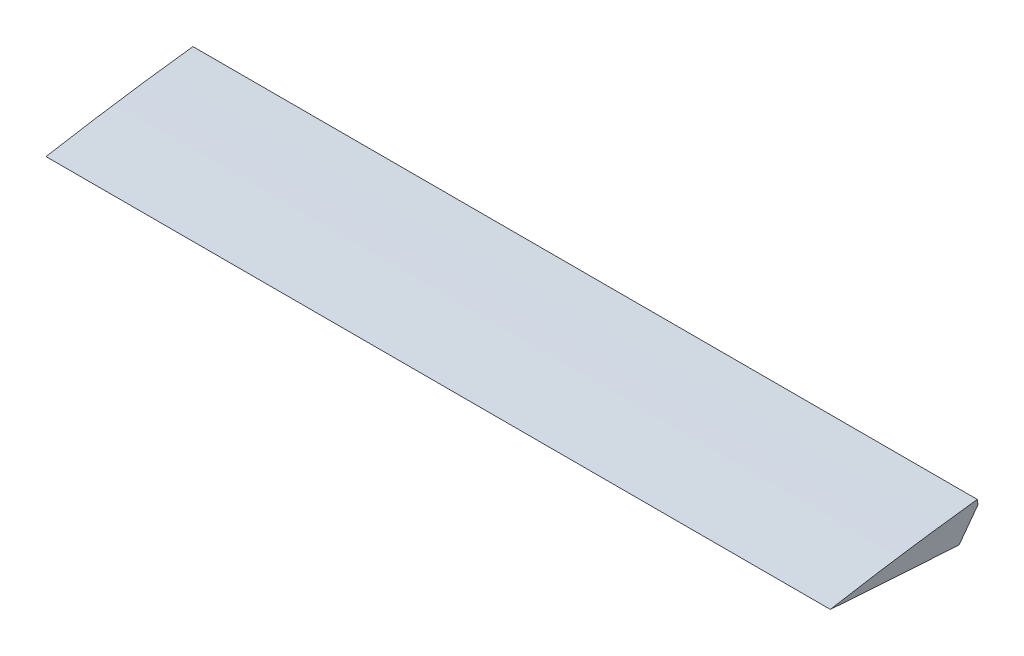
ISO-10303-21;
HEADER;
FILE_DESCRIPTION(('STEP AP214'),'2;1');
FILE_NAME('part.step','',(''),(''),'','','');
FILE_SCHEMA(('AUTOMOTIVE_DESIGN { 1 0 10303 214 1 1 1 1 }'));
ENDSEC;
DATA;
#1=APPLICATION_CONTEXT('core data for automotive mechanical design processes');
#2=APPLICATION_PROTOCOL_DEFINITION('international standard','automotive_design',2000,#1);
#3=PRODUCT_CONTEXT('',#1,'mechanical');
#4=PRODUCT('Part','Part','',(#3));
#5=PRODUCT_RELATED_PRODUCT_CATEGORY('part','',(#4));
#6=PRODUCT_DEFINITION_FORMATION('','',#4);
#7=PRODUCT_DEFINITION_CONTEXT('part definition',#1,'design');
#8=PRODUCT_DEFINITION('design','',#6,#7);
#9=PRODUCT_DEFINITION_SHAPE('','',#8);
#10=(LENGTH_UNIT() NAMED_UNIT(*) SI_UNIT(.MILLI.,.METRE.));
#11=(NAMED_UNIT(*) PLANE_ANGLE_UNIT() SI_UNIT($,.RADIAN.));
#12=(NAMED_UNIT(*) SI_UNIT($,.STERADIAN.) SOLID_ANGLE_UNIT());
#13=UNCERTAINTY_MEASURE_WITH_UNIT(LENGTH_MEASURE(1.E-05),#10,'distance_accuracy_value','');
#14=(GEOMETRIC_REPRESENTATION_CONTEXT(3) GLOBAL_UNCERTAINTY_ASSIGNED_CONTEXT((#13)) GLOBAL_UNIT_ASSIGNED_CONTEXT((#10,
#11,#12)) REPRESENTATION_CONTEXT('',''));
#15=CARTESIAN_POINT('',(0.,0.,0.));
#16=DIRECTION('',(0.,0.,1.));
#17=DIRECTION('',(1.,0.,0.));
#18=AXIS2_PLACEMENT_3D('',#15,#16,#17);
#19=CARTESIAN_POINT('',(-187.325,3467.35220178004,-189.415651011113));
#20=DIRECTION('',(1.,0.,0.));
#21=DIRECTION('',(0.,0.,1.));
#22=AXIS2_PLACEMENT_3D('',#19,#20,#21);
#23=CYLINDRICAL_SURFACE('',#22,3487.44198261828);
#24=CARTESIAN_POINT('',(187.325,3467.35220178004,-189.415651011113));
#25=DIRECTION('',(1.,0.,0.));
#26=DIRECTION('',(0.,0.,-1.));
#27=AXIS2_PLACEMENT_3D('',#24,#25,#26);
#28=CIRCLE('',#27,3487.44198261828);
#29=CARTESIAN_POINT('',(187.325,-10.4138152048303,70.1900369729345));
#30=VERTEX_POINT('',#29);
#31=CARTESIAN_POINT('',(187.325,-14.4619784667253,8.62877925903338));
#32=VERTEX_POINT('',#31);
#33=EDGE_CURVE('E78',#30,#32,#28,.T.);
#34=ORIENTED_EDGE('',*,*,#33,.F.);
#35=DIRECTION('',(1.,0.,0.));
#36=VECTOR('',#35,1.);
#37=CARTESIAN_POINT('',(-187.325,-10.4138152048303,70.1900369729345));
#38=LINE('',#37,#36);
#39=CARTESIAN_POINT('',(-187.325,-10.4138152048303,70.1900369729345));
#40=VERTEX_POINT('',#39);
#41=EDGE_CURVE('E46',#40,#30,#38,.T.);
#42=ORIENTED_EDGE('',*,*,#41,.F.);
#43=CARTESIAN_POINT('',(-187.325,3467.35220178004,-189.415651011113));
#44=DIRECTION('',(1.,0.,0.));
#45=DIRECTION('',(0.,0.,-1.));
#46=AXIS2_PLACEMENT_3D('',#43,#44,#45);
#47=CIRCLE('',#46,3487.44198261828);
#48=CARTESIAN_POINT('',(-187.325,-14.4619784667248,8.62877925903316));
#49=VERTEX_POINT('',#48);
#50=EDGE_CURVE('E82',#40,#49,#47,.T.);
#51=ORIENTED_EDGE('',*,*,#50,.T.);
#52=DIRECTION('',(1.,0.,0.));
#53=VECTOR('',#52,1.);
#54=CARTESIAN_POINT('',(-187.325,-14.4619784667248,8.62877925903316));
#55=LINE('',#54,#53);
#56=EDGE_CURVE('E89',#49,#32,#55,.T.);
#57=ORIENTED_EDGE('',*,*,#56,.T.);
#58=EDGE_LOOP('',(#34,#42,#51,#57));
#59=FACE_BOUND('',#58,.T.);
#60=ADVANCED_FACE('F38',(#59),#23,.T.);
#61=CARTESIAN_POINT('',(-187.325,0.,0.));
#62=DIRECTION('',(0.,-0.146759519125399,0.989172201159172));
#63=DIRECTION('',(0.,0.989172201159172,0.146759519125399));
#64=AXIS2_PLACEMENT_3D('',#61,#62,#63);
#65=PLANE('',#64);
#66=DIRECTION('',(0.,0.989172201159172,0.146759519125399));
#67=VECTOR('',#66,1.);
#68=CARTESIAN_POINT('',(-187.325,0.,0.));
#69=LINE('',#68,#67);
#70=CARTESIAN_POINT('',(-187.325,-2.35546630401006,-0.349471104917352));
#71=VERTEX_POINT('',#70);
#72=CARTESIAN_POINT('',(-187.325,2.22044604925031E-13,0.));
#73=VERTEX_POINT('',#72);
#74=EDGE_CURVE('E101',#71,#73,#69,.T.);
#75=ORIENTED_EDGE('',*,*,#74,.T.);
#76=DIRECTION('',(1.,0.,0.));
#77=VECTOR('',#76,1.);
#78=CARTESIAN_POINT('',(-187.325,2.22044604925031E-13,0.));
#79=LINE('',#78,#77);
#80=CARTESIAN_POINT('',(187.325,2.22044604925031E-13,0.));
#81=VERTEX_POINT('',#80);
#82=EDGE_CURVE('E11',#73,#81,#79,.T.);
#83=ORIENTED_EDGE('',*,*,#82,.T.);
#84=DIRECTION('',(0.,0.989172201159172,0.146759519125399));
#85=VECTOR('',#84,1.);
#86=CARTESIAN_POINT('',(187.325,0.,0.));
#87=LINE('',#86,#85);
#88=CARTESIAN_POINT('',(187.325,-2.35546630401006,-0.349471104917352));
#89=VERTEX_POINT('',#88);
#90=EDGE_CURVE('E80',#89,#81,#87,.T.);
#91=ORIENTED_EDGE('',*,*,#90,.F.);
#92=DIRECTION('',(1.,0.,0.));
#93=VECTOR('',#92,1.);
#94=CARTESIAN_POINT('',(-187.325,-2.35546630401006,-0.349471104917352));
#95=LINE('',#94,#93);
#96=EDGE_CURVE('E91',#71,#89,#95,.T.);
#97=ORIENTED_EDGE('',*,*,#96,.F.);
#98=EDGE_LOOP('',(#75,#83,#91,#97));
#99=FACE_BOUND('',#98,.T.);
#100=ADVANCED_FACE('F117',(#99),#65,.F.);
#101=CARTESIAN_POINT('',(-187.325,-1235.91978924871,-147.500932055786));
#102=DIRECTION('',(1.,0.,0.));
#103=DIRECTION('',(0.,0.,1.));
#104=AXIS2_PLACEMENT_3D('',#101,#102,#103);
#105=CYLINDRICAL_SURFACE('',#104,1244.69042352462);
#106=CARTESIAN_POINT('',(187.325,-1235.91978924871,-147.500932055786));
#107=DIRECTION('',(1.,0.,0.));
#108=DIRECTION('',(0.,0.,1.));
#109=AXIS2_PLACEMENT_3D('',#106,#107,#108);
#110=CIRCLE('',#109,1244.69042352462);
#111=EDGE_CURVE('E75',#81,#30,#110,.T.);
#112=ORIENTED_EDGE('',*,*,#111,.F.);
#113=ORIENTED_EDGE('',*,*,#82,.F.);
#114=CARTESIAN_POINT('',(-187.325,-1235.91978924871,-147.500932055786));
#115=DIRECTION('',(1.,0.,0.));
#116=DIRECTION('',(0.,0.,1.));
#117=AXIS2_PLACEMENT_3D('',#114,#115,#116);
#118=CIRCLE('',#117,1244.69042352462);
#119=EDGE_CURVE('E62',#73,#40,#118,.T.);
#120=ORIENTED_EDGE('',*,*,#119,.T.);
#121=ORIENTED_EDGE('',*,*,#41,.T.);
#122=EDGE_LOOP('',(#112,#113,#120,#121));
#123=FACE_BOUND('',#122,.T.);
#124=ADVANCED_FACE('F85',(#123),#105,.T.);
#125=CARTESIAN_POINT('',(-187.325,3467.35220178004,-189.415651011113));
#126=DIRECTION('',(-1.,0.,0.));
#127=DIRECTION('',(0.,0.,-1.));
#128=AXIS2_PLACEMENT_3D('',#125,#126,#127);
#129=PLANE('',#128);
#130=DIRECTION('',(0.,0.803225022378097,-0.59567572002366));
#131=VECTOR('',#130,1.);
#132=CARTESIAN_POINT('',(-187.325,-2.35546630401006,-0.349471104917352));
#133=LINE('',#132,#131);
#134=EDGE_CURVE('E105',#49,#71,#133,.T.);
#135=ORIENTED_EDGE('',*,*,#134,.F.);
#136=ORIENTED_EDGE('',*,*,#50,.F.);
#137=ORIENTED_EDGE('',*,*,#119,.F.);
#138=ORIENTED_EDGE('',*,*,#74,.F.);
#139=EDGE_LOOP('',(#135,#136,#137,#138));
#140=FACE_BOUND('',#139,.T.);
#141=ADVANCED_FACE('F119',(#140),#129,.T.);
#142=CARTESIAN_POINT('',(187.325,3467.35220178004,-189.415651011113));
#143=DIRECTION('',(-1.,0.,0.));
#144=DIRECTION('',(0.,0.,-1.));
#145=AXIS2_PLACEMENT_3D('',#142,#143,#144);
#146=PLANE('',#145);
#147=ORIENTED_EDGE('',*,*,#90,.T.);
#148=ORIENTED_EDGE('',*,*,#111,.T.);
#149=ORIENTED_EDGE('',*,*,#33,.T.);
#150=DIRECTION('',(0.,0.803225022378097,-0.59567572002366));
#151=VECTOR('',#150,1.);
#152=CARTESIAN_POINT('',(187.325,-2.35546630401006,-0.349471104917352));
#153=LINE('',#152,#151);
#154=EDGE_CURVE('E53',#32,#89,#153,.T.);
#155=ORIENTED_EDGE('',*,*,#154,.T.);
#156=EDGE_LOOP('',(#147,#148,#149,#155));
#157=FACE_BOUND('',#156,.T.);
#158=ADVANCED_FACE('F76',(#157),#146,.F.);
#159=CARTESIAN_POINT('',(-187.325,-2.35546630401006,-0.349471104917352));
#160=DIRECTION('',(0.,0.59567572002366,0.803225022378097));
#161=DIRECTION('',(0.,0.803225022378097,-0.59567572002366));
#162=AXIS2_PLACEMENT_3D('',#159,#160,#161);
#163=PLANE('',#162);
#164=ORIENTED_EDGE('',*,*,#96,.T.);
#165=ORIENTED_EDGE('',*,*,#154,.F.);
#166=ORIENTED_EDGE('',*,*,#56,.F.);
#167=ORIENTED_EDGE('',*,*,#134,.T.);
#168=EDGE_LOOP('',(#164,#165,#166,#167));
#169=FACE_BOUND('',#168,.T.);
#170=ADVANCED_FACE('F113',(#169),#163,.F.);
#171=CLOSED_SHELL('',(#60,#100,#124,#141,#158,#170));
#172=MANIFOLD_SOLID_BREP('B2',#171);
#173=ADVANCED_BREP_SHAPE_REPRESENTATION('',(#18,#172),#14);
#174=SHAPE_DEFINITION_REPRESENTATION(#9,#173);
ENDSEC;
END-ISO-10303-21;
